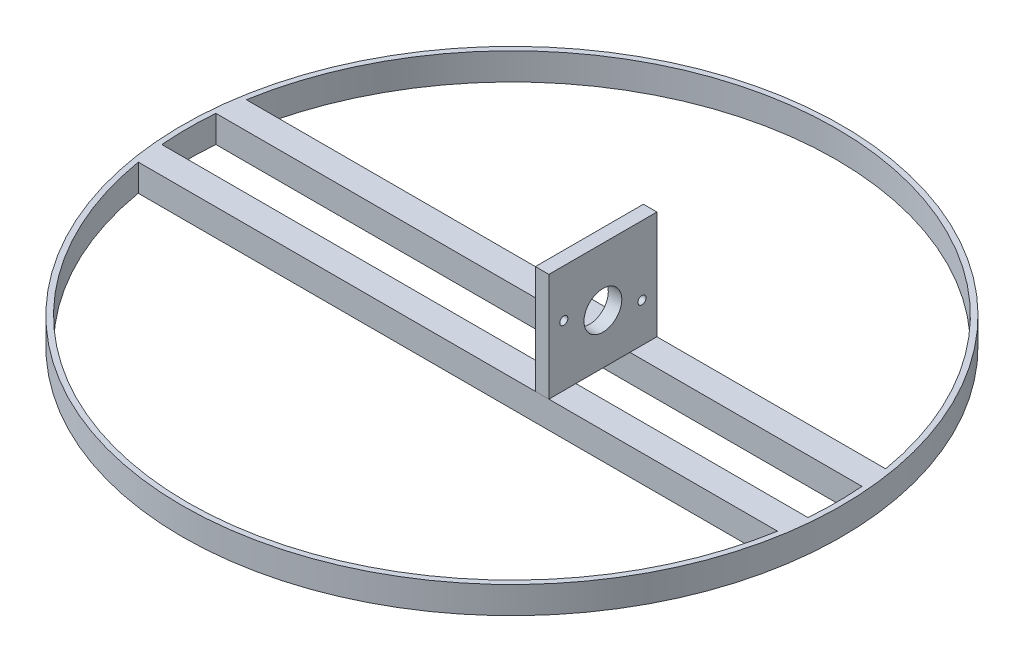
ISO-10303-21;
HEADER;
FILE_DESCRIPTION(('STEP AP214'),'2;1');
FILE_NAME('part.step','',(''),(''),'','','');
FILE_SCHEMA(('AUTOMOTIVE_DESIGN { 1 0 10303 214 1 1 1 1 }'));
ENDSEC;
DATA;
#1=APPLICATION_CONTEXT('core data for automotive mechanical design processes');
#2=APPLICATION_PROTOCOL_DEFINITION('international standard','automotive_design',2000,#1);
#3=PRODUCT_CONTEXT('',#1,'mechanical');
#4=PRODUCT('Part','Part','',(#3));
#5=PRODUCT_RELATED_PRODUCT_CATEGORY('part','',(#4));
#6=PRODUCT_DEFINITION_FORMATION('','',#4);
#7=PRODUCT_DEFINITION_CONTEXT('part definition',#1,'design');
#8=PRODUCT_DEFINITION('design','',#6,#7);
#9=PRODUCT_DEFINITION_SHAPE('','',#8);
#10=(LENGTH_UNIT() NAMED_UNIT(*) SI_UNIT(.MILLI.,.METRE.));
#11=(NAMED_UNIT(*) PLANE_ANGLE_UNIT() SI_UNIT($,.RADIAN.));
#12=(NAMED_UNIT(*) SI_UNIT($,.STERADIAN.) SOLID_ANGLE_UNIT());
#13=UNCERTAINTY_MEASURE_WITH_UNIT(LENGTH_MEASURE(1.E-05),#10,'distance_accuracy_value','');
#14=(GEOMETRIC_REPRESENTATION_CONTEXT(3) GLOBAL_UNCERTAINTY_ASSIGNED_CONTEXT((#13)) GLOBAL_UNIT_ASSIGNED_CONTEXT((#10,
#11,#12)) REPRESENTATION_CONTEXT('',''));
#15=CARTESIAN_POINT('',(0.,0.,0.));
#16=DIRECTION('',(0.,0.,1.));
#17=DIRECTION('',(1.,0.,0.));
#18=AXIS2_PLACEMENT_3D('',#15,#16,#17);
#19=CARTESIAN_POINT('',(-100.,0.,0.));
#20=DIRECTION('',(-1.,0.,0.));
#21=DIRECTION('',(0.,0.,1.));
#22=AXIS2_PLACEMENT_3D('',#19,#20,#21);
#23=PLANE('',#22);
#24=DIRECTION('',(0.,-1.,0.));
#25=VECTOR('',#24,1.);
#26=CARTESIAN_POINT('',(-100.,10.,120.860732568359));
#27=LINE('',#26,#25);
#28=CARTESIAN_POINT('',(-100.,50.,120.860732568359));
#29=VERTEX_POINT('',#28);
#30=CARTESIAN_POINT('',(-100.,10.,120.860732568359));
#31=VERTEX_POINT('',#30);
#32=EDGE_CURVE('E126',#29,#31,#27,.T.);
#33=ORIENTED_EDGE('',*,*,#32,.T.);
#34=DIRECTION('',(0.,0.,-1.));
#35=VECTOR('',#34,1.);
#36=CARTESIAN_POINT('',(-100.,10.,120.860732568359));
#37=LINE('',#36,#35);
#38=CARTESIAN_POINT('',(-100.,10.,80.8607325683594));
#39=VERTEX_POINT('',#38);
#40=EDGE_CURVE('E121',#31,#39,#37,.T.);
#41=ORIENTED_EDGE('',*,*,#40,.T.);
#42=DIRECTION('',(0.,1.,0.));
#43=VECTOR('',#42,1.);
#44=CARTESIAN_POINT('',(-100.,50.,80.8607325683594));
#45=LINE('',#44,#43);
#46=CARTESIAN_POINT('',(-100.,50.,80.8607325683594));
#47=VERTEX_POINT('',#46);
#48=EDGE_CURVE('E124',#39,#47,#45,.T.);
#49=ORIENTED_EDGE('',*,*,#48,.T.);
#50=DIRECTION('',(0.,0.,1.));
#51=VECTOR('',#50,1.);
#52=CARTESIAN_POINT('',(-100.,50.,120.860732568359));
#53=LINE('',#52,#51);
#54=EDGE_CURVE('E91',#47,#29,#53,.T.);
#55=ORIENTED_EDGE('',*,*,#54,.T.);
#56=EDGE_LOOP('',(#33,#41,#49,#55));
#57=FACE_BOUND('',#56,.T.);
#58=CARTESIAN_POINT('',(-100.,24.5198487765855,86.3891594698893));
#59=DIRECTION('',(1.,0.,0.));
#60=DIRECTION('',(0.,0.,-1.));
#61=AXIS2_PLACEMENT_3D('',#58,#59,#60);
#62=CIRCLE('',#61,1.50000000000001);
#63=CARTESIAN_POINT('',(-100.,24.5198487765855,84.8891594698893));
#64=VERTEX_POINT('',#63);
#65=EDGE_CURVE('E141',#64,#64,#62,.T.);
#66=ORIENTED_EDGE('',*,*,#65,.F.);
#67=EDGE_LOOP('',(#66));
#68=FACE_BOUND('',#67,.T.);
#69=CARTESIAN_POINT('',(-100.,32.4125218486534,115.33230566683));
#70=DIRECTION('',(1.,0.,0.));
#71=DIRECTION('',(0.,0.,-1.));
#72=AXIS2_PLACEMENT_3D('',#69,#70,#71);
#73=CIRCLE('',#72,1.50000000000001);
#74=CARTESIAN_POINT('',(-100.,32.4125218486534,113.83230566683));
#75=VERTEX_POINT('',#74);
#76=EDGE_CURVE('E156',#75,#75,#73,.T.);
#77=ORIENTED_EDGE('',*,*,#76,.F.);
#78=EDGE_LOOP('',(#77));
#79=FACE_BOUND('',#78,.T.);
#80=CARTESIAN_POINT('',(-100.,28.4661853126194,100.860732568359));
#81=DIRECTION('',(1.,0.,0.));
#82=DIRECTION('',(0.,0.,-1.));
#83=AXIS2_PLACEMENT_3D('',#80,#81,#82);
#84=CIRCLE('',#83,7.);
#85=CARTESIAN_POINT('',(-100.,28.4661853126194,93.8607325683594));
#86=VERTEX_POINT('',#85);
#87=EDGE_CURVE('E162',#86,#86,#84,.T.);
#88=ORIENTED_EDGE('',*,*,#87,.F.);
#89=EDGE_LOOP('',(#88));
#90=FACE_BOUND('',#89,.T.);
#91=ADVANCED_FACE('F74',(#57,#68,#79,#90),#23,.F.);
#92=CARTESIAN_POINT('',(-105.,0.,0.));
#93=DIRECTION('',(-1.,0.,0.));
#94=DIRECTION('',(0.,0.,1.));
#95=AXIS2_PLACEMENT_3D('',#92,#93,#94);
#96=PLANE('',#95);
#97=CARTESIAN_POINT('',(-105.,32.4125218486534,115.33230566683));
#98=DIRECTION('',(1.,0.,0.));
#99=DIRECTION('',(0.,0.,-1.));
#100=AXIS2_PLACEMENT_3D('',#97,#98,#99);
#101=CIRCLE('',#100,1.50000000000001);
#102=CARTESIAN_POINT('',(-105.,32.4125218486534,113.83230566683));
#103=VERTEX_POINT('',#102);
#104=EDGE_CURVE('E159',#103,#103,#101,.T.);
#105=ORIENTED_EDGE('',*,*,#104,.T.);
#106=EDGE_LOOP('',(#105));
#107=FACE_BOUND('',#106,.T.);
#108=DIRECTION('',(0.,-1.,0.));
#109=VECTOR('',#108,1.);
#110=CARTESIAN_POINT('',(-105.,10.,120.860732568359));
#111=LINE('',#110,#109);
#112=CARTESIAN_POINT('',(-105.,50.,120.860732568359));
#113=VERTEX_POINT('',#112);
#114=CARTESIAN_POINT('',(-105.,10.,120.860732568359));
#115=VERTEX_POINT('',#114);
#116=EDGE_CURVE('E138',#113,#115,#111,.T.);
#117=ORIENTED_EDGE('',*,*,#116,.F.);
#118=DIRECTION('',(0.,0.,1.));
#119=VECTOR('',#118,1.);
#120=CARTESIAN_POINT('',(-105.,50.,120.860732568359));
#121=LINE('',#120,#119);
#122=CARTESIAN_POINT('',(-105.,50.,80.8607325683594));
#123=VERTEX_POINT('',#122);
#124=EDGE_CURVE('E114',#123,#113,#121,.T.);
#125=ORIENTED_EDGE('',*,*,#124,.F.);
#126=DIRECTION('',(0.,1.,0.));
#127=VECTOR('',#126,1.);
#128=CARTESIAN_POINT('',(-105.,50.,80.8607325683594));
#129=LINE('',#128,#127);
#130=CARTESIAN_POINT('',(-105.,10.,80.8607325683594));
#131=VERTEX_POINT('',#130);
#132=EDGE_CURVE('E108',#131,#123,#129,.T.);
#133=ORIENTED_EDGE('',*,*,#132,.F.);
#134=DIRECTION('',(0.,0.,-1.));
#135=VECTOR('',#134,1.);
#136=CARTESIAN_POINT('',(-105.,10.,120.860732568359));
#137=LINE('',#136,#135);
#138=EDGE_CURVE('E130',#115,#131,#137,.T.);
#139=ORIENTED_EDGE('',*,*,#138,.F.);
#140=EDGE_LOOP('',(#117,#125,#133,#139));
#141=FACE_BOUND('',#140,.T.);
#142=CARTESIAN_POINT('',(-105.,24.5198487765855,86.3891594698893));
#143=DIRECTION('',(1.,0.,0.));
#144=DIRECTION('',(0.,0.,-1.));
#145=AXIS2_PLACEMENT_3D('',#142,#143,#144);
#146=CIRCLE('',#145,1.50000000000001);
#147=CARTESIAN_POINT('',(-105.,24.5198487765855,84.8891594698893));
#148=VERTEX_POINT('',#147);
#149=EDGE_CURVE('E153',#148,#148,#146,.T.);
#150=ORIENTED_EDGE('',*,*,#149,.T.);
#151=EDGE_LOOP('',(#150));
#152=FACE_BOUND('',#151,.T.);
#153=CARTESIAN_POINT('',(-105.,28.4661853126194,100.860732568359));
#154=DIRECTION('',(1.,0.,0.));
#155=DIRECTION('',(0.,0.,-1.));
#156=AXIS2_PLACEMENT_3D('',#153,#154,#155);
#157=CIRCLE('',#156,7.);
#158=CARTESIAN_POINT('',(-105.,28.4661853126194,93.8607325683594));
#159=VERTEX_POINT('',#158);
#160=EDGE_CURVE('E165',#159,#159,#157,.T.);
#161=ORIENTED_EDGE('',*,*,#160,.T.);
#162=EDGE_LOOP('',(#161));
#163=FACE_BOUND('',#162,.T.);
#164=ADVANCED_FACE('F149',(#107,#141,#152,#163),#96,.T.);
#165=CARTESIAN_POINT('',(-100.,10.,120.860732568359));
#166=DIRECTION('',(0.,0.,-1.));
#167=DIRECTION('',(-1.,0.,0.));
#168=AXIS2_PLACEMENT_3D('',#165,#166,#167);
#169=PLANE('',#168);
#170=ORIENTED_EDGE('',*,*,#116,.T.);
#171=DIRECTION('',(-1.,0.,0.));
#172=VECTOR('',#171,1.);
#173=CARTESIAN_POINT('',(-100.,10.,120.860732568359));
#174=LINE('',#173,#172);
#175=EDGE_CURVE('E14',#31,#115,#174,.T.);
#176=ORIENTED_EDGE('',*,*,#175,.F.);
#177=ORIENTED_EDGE('',*,*,#32,.F.);
#178=DIRECTION('',(-1.,0.,0.));
#179=VECTOR('',#178,1.);
#180=CARTESIAN_POINT('',(-100.,50.,120.860732568359));
#181=LINE('',#180,#179);
#182=EDGE_CURVE('E134',#29,#113,#181,.T.);
#183=ORIENTED_EDGE('',*,*,#182,.T.);
#184=EDGE_LOOP('',(#170,#176,#177,#183));
#185=FACE_BOUND('',#184,.T.);
#186=ADVANCED_FACE('F76',(#185),#169,.F.);
#187=CARTESIAN_POINT('',(-100.,10.,120.860732568359));
#188=DIRECTION('',(0.,1.,0.));
#189=DIRECTION('',(0.,0.,1.));
#190=AXIS2_PLACEMENT_3D('',#187,#188,#189);
#191=PLANE('',#190);
#192=ORIENTED_EDGE('',*,*,#138,.T.);
#193=DIRECTION('',(-1.,0.,0.));
#194=VECTOR('',#193,1.);
#195=CARTESIAN_POINT('',(-100.,10.,80.8607325683594));
#196=LINE('',#195,#194);
#197=EDGE_CURVE('E83',#39,#131,#196,.T.);
#198=ORIENTED_EDGE('',*,*,#197,.F.);
#199=ORIENTED_EDGE('',*,*,#40,.F.);
#200=ORIENTED_EDGE('',*,*,#175,.T.);
#201=EDGE_LOOP('',(#192,#198,#199,#200));
#202=FACE_BOUND('',#201,.T.);
#203=ADVANCED_FACE('F129',(#202),#191,.F.);
#204=CARTESIAN_POINT('',(-100.,50.,80.8607325683594));
#205=DIRECTION('',(0.,0.,1.));
#206=DIRECTION('',(1.,0.,0.));
#207=AXIS2_PLACEMENT_3D('',#204,#205,#206);
#208=PLANE('',#207);
#209=ORIENTED_EDGE('',*,*,#132,.T.);
#210=DIRECTION('',(-1.,0.,0.));
#211=VECTOR('',#210,1.);
#212=CARTESIAN_POINT('',(-100.,50.,80.8607325683594));
#213=LINE('',#212,#211);
#214=EDGE_CURVE('E131',#47,#123,#213,.T.);
#215=ORIENTED_EDGE('',*,*,#214,.F.);
#216=ORIENTED_EDGE('',*,*,#48,.F.);
#217=ORIENTED_EDGE('',*,*,#197,.T.);
#218=EDGE_LOOP('',(#209,#215,#216,#217));
#219=FACE_BOUND('',#218,.T.);
#220=ADVANCED_FACE('F132',(#219),#208,.F.);
#221=CARTESIAN_POINT('',(-100.,50.,120.860732568359));
#222=DIRECTION('',(0.,-1.,0.));
#223=DIRECTION('',(0.,0.,-1.));
#224=AXIS2_PLACEMENT_3D('',#221,#222,#223);
#225=PLANE('',#224);
#226=ORIENTED_EDGE('',*,*,#124,.T.);
#227=ORIENTED_EDGE('',*,*,#182,.F.);
#228=ORIENTED_EDGE('',*,*,#54,.F.);
#229=ORIENTED_EDGE('',*,*,#214,.T.);
#230=EDGE_LOOP('',(#226,#227,#228,#229));
#231=FACE_BOUND('',#230,.T.);
#232=ADVANCED_FACE('F146',(#231),#225,.F.);
#233=CARTESIAN_POINT('',(-100.,24.5198487765855,86.3891594698893));
#234=DIRECTION('',(-1.,0.,0.));
#235=DIRECTION('',(0.,0.,1.));
#236=AXIS2_PLACEMENT_3D('',#233,#234,#235);
#237=CYLINDRICAL_SURFACE('',#236,1.50000000000001);
#238=ORIENTED_EDGE('',*,*,#65,.T.);
#239=EDGE_LOOP('',(#238));
#240=FACE_BOUND('',#239,.T.);
#241=ORIENTED_EDGE('',*,*,#149,.F.);
#242=EDGE_LOOP('',(#241));
#243=FACE_BOUND('',#242,.T.);
#244=ADVANCED_FACE('F182',(#240,#243),#237,.F.);
#245=CARTESIAN_POINT('',(-100.,32.4125218486534,115.33230566683));
#246=DIRECTION('',(-1.,0.,0.));
#247=DIRECTION('',(0.,0.,1.));
#248=AXIS2_PLACEMENT_3D('',#245,#246,#247);
#249=CYLINDRICAL_SURFACE('',#248,1.50000000000001);
#250=ORIENTED_EDGE('',*,*,#76,.T.);
#251=EDGE_LOOP('',(#250));
#252=FACE_BOUND('',#251,.T.);
#253=ORIENTED_EDGE('',*,*,#104,.F.);
#254=EDGE_LOOP('',(#253));
#255=FACE_BOUND('',#254,.T.);
#256=ADVANCED_FACE('F228',(#252,#255),#249,.F.);
#257=CARTESIAN_POINT('',(-100.,28.4661853126194,100.860732568359));
#258=DIRECTION('',(-1.,0.,0.));
#259=DIRECTION('',(0.,0.,1.));
#260=AXIS2_PLACEMENT_3D('',#257,#258,#259);
#261=CYLINDRICAL_SURFACE('',#260,7.);
#262=ORIENTED_EDGE('',*,*,#87,.T.);
#263=EDGE_LOOP('',(#262));
#264=FACE_BOUND('',#263,.T.);
#265=ORIENTED_EDGE('',*,*,#160,.F.);
#266=EDGE_LOOP('',(#265));
#267=FACE_BOUND('',#266,.T.);
#268=ADVANCED_FACE('F171',(#264,#267),#261,.F.);
#269=CLOSED_SHELL('',(#91,#164,#186,#203,#220,#232,#244,#256,#268));
#270=MANIFOLD_SOLID_BREP('B2',#269);
#271=CARTESIAN_POINT('',(-133.671737877986,10.,100.860732568359));
#272=DIRECTION('',(0.,1.,0.));
#273=DIRECTION('',(0.,0.,1.));
#274=AXIS2_PLACEMENT_3D('',#271,#272,#273);
#275=PLANE('',#274);
#276=CARTESIAN_POINT('',(-133.671737877986,10.,100.860732568359));
#277=DIRECTION('',(0.,1.,0.));
#278=DIRECTION('',(0.,0.,1.));
#279=AXIS2_PLACEMENT_3D('',#276,#277,#278);
#280=CIRCLE('',#279,120.);
#281=CARTESIAN_POINT('',(-15.3501422159941,10.,80.8607325683594));
#282=VERTEX_POINT('',#281);
#283=CARTESIAN_POINT('',(-251.993333539979,10.,80.8607325683594));
#284=VERTEX_POINT('',#283);
#285=EDGE_CURVE('E333',#282,#284,#280,.T.);
#286=ORIENTED_EDGE('',*,*,#285,.F.);
#287=DIRECTION('',(1.,0.,0.));
#288=VECTOR('',#287,1.);
#289=CARTESIAN_POINT('',(-300.,10.,80.8607325683594));
#290=LINE('',#289,#288);
#291=EDGE_CURVE('E364',#284,#282,#290,.T.);
#292=ORIENTED_EDGE('',*,*,#291,.F.);
#293=EDGE_LOOP('',(#286,#292));
#294=FACE_BOUND('',#293,.T.);
#295=CARTESIAN_POINT('',(-253.254345309,10.,90.8607325683594));
#296=VERTEX_POINT('',#295);
#297=CARTESIAN_POINT('',(-253.254345309,10.,110.860732568359));
#298=VERTEX_POINT('',#297);
#299=EDGE_CURVE('E349',#296,#298,#280,.T.);
#300=ORIENTED_EDGE('',*,*,#299,.F.);
#301=DIRECTION('',(1.,0.,0.));
#302=VECTOR('',#301,1.);
#303=CARTESIAN_POINT('',(-300.,10.,90.8607325683594));
#304=LINE('',#303,#302);
#305=CARTESIAN_POINT('',(-14.0891304469725,10.,90.8607325683594));
#306=VERTEX_POINT('',#305);
#307=EDGE_CURVE('E341',#296,#306,#304,.T.);
#308=ORIENTED_EDGE('',*,*,#307,.T.);
#309=CARTESIAN_POINT('',(-14.0891304469725,10.,110.860732568359));
#310=VERTEX_POINT('',#309);
#311=EDGE_CURVE('E321',#310,#306,#280,.T.);
#312=ORIENTED_EDGE('',*,*,#311,.F.);
#313=DIRECTION('',(1.,0.,0.));
#314=VECTOR('',#313,1.);
#315=CARTESIAN_POINT('',(-300.,10.,110.860732568359));
#316=LINE('',#315,#314);
#317=EDGE_CURVE('E359',#298,#310,#316,.T.);
#318=ORIENTED_EDGE('',*,*,#317,.F.);
#319=EDGE_LOOP('',(#300,#308,#312,#318));
#320=FACE_BOUND('',#319,.T.);
#321=CARTESIAN_POINT('',(-251.993333539979,10.,120.860732568359));
#322=VERTEX_POINT('',#321);
#323=CARTESIAN_POINT('',(-15.3501422159941,10.,120.860732568359));
#324=VERTEX_POINT('',#323);
#325=EDGE_CURVE('E335',#322,#324,#280,.T.);
#326=ORIENTED_EDGE('',*,*,#325,.F.);
#327=DIRECTION('',(1.,0.,0.));
#328=VECTOR('',#327,1.);
#329=CARTESIAN_POINT('',(-300.,10.,120.860732568359));
#330=LINE('',#329,#328);
#331=EDGE_CURVE('E355',#322,#324,#330,.T.);
#332=ORIENTED_EDGE('',*,*,#331,.T.);
#333=EDGE_LOOP('',(#326,#332));
#334=FACE_BOUND('',#333,.T.);
#335=CARTESIAN_POINT('',(-133.671737877986,10.,100.860732568359));
#336=DIRECTION('',(0.,1.,0.));
#337=DIRECTION('',(0.,0.,1.));
#338=AXIS2_PLACEMENT_3D('',#335,#336,#337);
#339=CIRCLE('',#338,122.);
#340=CARTESIAN_POINT('',(-133.671737877986,10.,222.860732568359));
#341=VERTEX_POINT('',#340);
#342=EDGE_CURVE('E371',#341,#341,#339,.T.);
#343=ORIENTED_EDGE('',*,*,#342,.T.);
#344=EDGE_LOOP('',(#343));
#345=FACE_BOUND('',#344,.T.);
#346=ADVANCED_FACE('F260',(#294,#320,#334,#345),#275,.T.);
#347=CARTESIAN_POINT('',(-133.671737877986,0.,100.860732568359));
#348=DIRECTION('',(0.,1.,0.));
#349=DIRECTION('',(0.,0.,1.));
#350=AXIS2_PLACEMENT_3D('',#347,#348,#349);
#351=PLANE('',#350);
#352=DIRECTION('',(1.,0.,0.));
#353=VECTOR('',#352,1.);
#354=CARTESIAN_POINT('',(-300.,0.,80.8607325683594));
#355=LINE('',#354,#353);
#356=CARTESIAN_POINT('',(-251.993333539979,0.,80.8607325683594));
#357=VERTEX_POINT('',#356);
#358=CARTESIAN_POINT('',(-15.3501422159941,0.,80.8607325683594));
#359=VERTEX_POINT('',#358);
#360=EDGE_CURVE('E351',#357,#359,#355,.T.);
#361=ORIENTED_EDGE('',*,*,#360,.T.);
#362=CARTESIAN_POINT('',(-133.671737877986,0.,100.860732568359));
#363=DIRECTION('',(0.,1.,0.));
#364=DIRECTION('',(0.,0.,1.));
#365=AXIS2_PLACEMENT_3D('',#362,#363,#364);
#366=CIRCLE('',#365,120.);
#367=EDGE_CURVE('E278',#359,#357,#366,.T.);
#368=ORIENTED_EDGE('',*,*,#367,.T.);
#369=EDGE_LOOP('',(#361,#368));
#370=FACE_BOUND('',#369,.T.);
#371=DIRECTION('',(1.,0.,0.));
#372=VECTOR('',#371,1.);
#373=CARTESIAN_POINT('',(-300.,0.,90.8607325683594));
#374=LINE('',#373,#372);
#375=CARTESIAN_POINT('',(-253.254345309,0.,90.8607325683594));
#376=VERTEX_POINT('',#375);
#377=CARTESIAN_POINT('',(-14.0891304469725,0.,90.8607325683594));
#378=VERTEX_POINT('',#377);
#379=EDGE_CURVE('E343',#376,#378,#374,.T.);
#380=ORIENTED_EDGE('',*,*,#379,.F.);
#381=CARTESIAN_POINT('',(-253.254345309,0.,110.860732568359));
#382=VERTEX_POINT('',#381);
#383=EDGE_CURVE('E370',#376,#382,#366,.T.);
#384=ORIENTED_EDGE('',*,*,#383,.T.);
#385=DIRECTION('',(1.,0.,0.));
#386=VECTOR('',#385,1.);
#387=CARTESIAN_POINT('',(-300.,0.,110.860732568359));
#388=LINE('',#387,#386);
#389=CARTESIAN_POINT('',(-14.0891304469725,0.,110.860732568359));
#390=VERTEX_POINT('',#389);
#391=EDGE_CURVE('E361',#382,#390,#388,.T.);
#392=ORIENTED_EDGE('',*,*,#391,.T.);
#393=EDGE_CURVE('E367',#390,#378,#366,.T.);
#394=ORIENTED_EDGE('',*,*,#393,.T.);
#395=EDGE_LOOP('',(#380,#384,#392,#394));
#396=FACE_BOUND('',#395,.T.);
#397=DIRECTION('',(1.,0.,0.));
#398=VECTOR('',#397,1.);
#399=CARTESIAN_POINT('',(-300.,0.,120.860732568359));
#400=LINE('',#399,#398);
#401=CARTESIAN_POINT('',(-251.993333539979,0.,120.860732568359));
#402=VERTEX_POINT('',#401);
#403=CARTESIAN_POINT('',(-15.3501422159941,0.,120.860732568359));
#404=VERTEX_POINT('',#403);
#405=EDGE_CURVE('E363',#402,#404,#400,.T.);
#406=ORIENTED_EDGE('',*,*,#405,.F.);
#407=EDGE_CURVE('E358',#402,#404,#366,.T.);
#408=ORIENTED_EDGE('',*,*,#407,.T.);
#409=EDGE_LOOP('',(#406,#408));
#410=FACE_BOUND('',#409,.T.);
#411=CARTESIAN_POINT('',(-133.671737877986,0.,100.860732568359));
#412=DIRECTION('',(0.,1.,0.));
#413=DIRECTION('',(0.,0.,1.));
#414=AXIS2_PLACEMENT_3D('',#411,#412,#413);
#415=CIRCLE('',#414,122.);
#416=CARTESIAN_POINT('',(-133.671737877986,0.,222.860732568359));
#417=VERTEX_POINT('',#416);
#418=EDGE_CURVE('E332',#417,#417,#415,.T.);
#419=ORIENTED_EDGE('',*,*,#418,.F.);
#420=EDGE_LOOP('',(#419));
#421=FACE_BOUND('',#420,.T.);
#422=ADVANCED_FACE('F394',(#370,#396,#410,#421),#351,.F.);
#423=CARTESIAN_POINT('',(-133.671737877986,10.,100.860732568359));
#424=DIRECTION('',(0.,-1.,0.));
#425=DIRECTION('',(0.,0.,-1.));
#426=AXIS2_PLACEMENT_3D('',#423,#424,#425);
#427=CYLINDRICAL_SURFACE('',#426,120.);
#428=DIRECTION('',(0.,-1.,0.));
#429=VECTOR('',#428,1.);
#430=CARTESIAN_POINT('',(-15.3501422159941,10.,80.8607325683594));
#431=LINE('',#430,#429);
#432=EDGE_CURVE('E72',#282,#359,#431,.T.);
#433=ORIENTED_EDGE('',*,*,#432,.F.);
#434=ORIENTED_EDGE('',*,*,#285,.T.);
#435=DIRECTION('',(0.,-1.,0.));
#436=VECTOR('',#435,1.);
#437=CARTESIAN_POINT('',(-251.993333539979,10.,80.8607325683594));
#438=LINE('',#437,#436);
#439=EDGE_CURVE('E268',#357,#284,#438,.F.);
#440=ORIENTED_EDGE('',*,*,#439,.F.);
#441=ORIENTED_EDGE('',*,*,#367,.F.);
#442=EDGE_LOOP('',(#433,#434,#440,#441));
#443=FACE_BOUND('',#442,.T.);
#444=ADVANCED_FACE('F403',(#443),#427,.F.);
#445=DIRECTION('',(0.,-1.,0.));
#446=VECTOR('',#445,1.);
#447=CARTESIAN_POINT('',(-253.254345309,10.,90.8607325683594));
#448=LINE('',#447,#446);
#449=EDGE_CURVE('E344',#296,#376,#448,.T.);
#450=ORIENTED_EDGE('',*,*,#449,.F.);
#451=ORIENTED_EDGE('',*,*,#299,.T.);
#452=DIRECTION('',(0.,-1.,0.));
#453=VECTOR('',#452,1.);
#454=CARTESIAN_POINT('',(-253.254345309,10.,110.860732568359));
#455=LINE('',#454,#453);
#456=EDGE_CURVE('E374',#382,#298,#455,.F.);
#457=ORIENTED_EDGE('',*,*,#456,.F.);
#458=ORIENTED_EDGE('',*,*,#383,.F.);
#459=EDGE_LOOP('',(#450,#451,#457,#458));
#460=FACE_BOUND('',#459,.T.);
#461=ADVANCED_FACE('F402',(#460),#427,.F.);
#462=DIRECTION('',(0.,-1.,0.));
#463=VECTOR('',#462,1.);
#464=CARTESIAN_POINT('',(-251.993333539979,10.,120.860732568359));
#465=LINE('',#464,#463);
#466=EDGE_CURVE('E345',#322,#402,#465,.T.);
#467=ORIENTED_EDGE('',*,*,#466,.F.);
#468=ORIENTED_EDGE('',*,*,#325,.T.);
#469=DIRECTION('',(0.,-1.,0.));
#470=VECTOR('',#469,1.);
#471=CARTESIAN_POINT('',(-15.3501422159941,10.,120.860732568359));
#472=LINE('',#471,#470);
#473=EDGE_CURVE('E380',#404,#324,#472,.F.);
#474=ORIENTED_EDGE('',*,*,#473,.F.);
#475=ORIENTED_EDGE('',*,*,#407,.F.);
#476=EDGE_LOOP('',(#467,#468,#474,#475));
#477=FACE_BOUND('',#476,.T.);
#478=ADVANCED_FACE('F410',(#477),#427,.F.);
#479=CARTESIAN_POINT('',(-133.671737877986,10.,100.860732568359));
#480=DIRECTION('',(0.,-1.,0.));
#481=DIRECTION('',(0.,0.,-1.));
#482=AXIS2_PLACEMENT_3D('',#479,#480,#481);
#483=CYLINDRICAL_SURFACE('',#482,122.);
#484=ORIENTED_EDGE('',*,*,#342,.F.);
#485=EDGE_LOOP('',(#484));
#486=FACE_BOUND('',#485,.T.);
#487=ORIENTED_EDGE('',*,*,#418,.T.);
#488=EDGE_LOOP('',(#487));
#489=FACE_BOUND('',#488,.T.);
#490=ADVANCED_FACE('F262',(#486,#489),#483,.T.);
#491=DIRECTION('',(0.,-1.,0.));
#492=VECTOR('',#491,1.);
#493=CARTESIAN_POINT('',(-14.0891304469725,10.,90.8607325683594));
#494=LINE('',#493,#492);
#495=EDGE_CURVE('E325',#378,#306,#494,.F.);
#496=ORIENTED_EDGE('',*,*,#495,.F.);
#497=ORIENTED_EDGE('',*,*,#393,.F.);
#498=DIRECTION('',(0.,-1.,0.));
#499=VECTOR('',#498,1.);
#500=CARTESIAN_POINT('',(-14.0891304469725,10.,110.860732568359));
#501=LINE('',#500,#499);
#502=EDGE_CURVE('E328',#310,#390,#501,.T.);
#503=ORIENTED_EDGE('',*,*,#502,.F.);
#504=ORIENTED_EDGE('',*,*,#311,.T.);
#505=EDGE_LOOP('',(#496,#497,#503,#504));
#506=FACE_BOUND('',#505,.T.);
#507=ADVANCED_FACE('F323',(#506),#427,.F.);
#508=CARTESIAN_POINT('',(-300.,10.,110.860732568359));
#509=DIRECTION('',(0.,0.,-1.));
#510=DIRECTION('',(-1.,0.,0.));
#511=AXIS2_PLACEMENT_3D('',#508,#509,#510);
#512=PLANE('',#511);
#513=ORIENTED_EDGE('',*,*,#317,.T.);
#514=ORIENTED_EDGE('',*,*,#502,.T.);
#515=ORIENTED_EDGE('',*,*,#391,.F.);
#516=ORIENTED_EDGE('',*,*,#456,.T.);
#517=EDGE_LOOP('',(#513,#514,#515,#516));
#518=FACE_BOUND('',#517,.T.);
#519=ADVANCED_FACE('F401',(#518),#512,.T.);
#520=CARTESIAN_POINT('',(-300.,10.,120.860732568359));
#521=DIRECTION('',(0.,0.,1.));
#522=DIRECTION('',(1.,0.,0.));
#523=AXIS2_PLACEMENT_3D('',#520,#521,#522);
#524=PLANE('',#523);
#525=ORIENTED_EDGE('',*,*,#331,.F.);
#526=ORIENTED_EDGE('',*,*,#466,.T.);
#527=ORIENTED_EDGE('',*,*,#405,.T.);
#528=ORIENTED_EDGE('',*,*,#473,.T.);
#529=EDGE_LOOP('',(#525,#526,#527,#528));
#530=FACE_BOUND('',#529,.T.);
#531=ADVANCED_FACE('F448',(#530),#524,.T.);
#532=CARTESIAN_POINT('',(-300.,10.,90.8607325683594));
#533=DIRECTION('',(0.,0.,1.));
#534=DIRECTION('',(1.,0.,0.));
#535=AXIS2_PLACEMENT_3D('',#532,#533,#534);
#536=PLANE('',#535);
#537=ORIENTED_EDGE('',*,*,#307,.F.);
#538=ORIENTED_EDGE('',*,*,#449,.T.);
#539=ORIENTED_EDGE('',*,*,#379,.T.);
#540=ORIENTED_EDGE('',*,*,#495,.T.);
#541=EDGE_LOOP('',(#537,#538,#539,#540));
#542=FACE_BOUND('',#541,.T.);
#543=ADVANCED_FACE('F339',(#542),#536,.T.);
#544=CARTESIAN_POINT('',(-300.,10.,80.8607325683594));
#545=DIRECTION('',(0.,0.,-1.));
#546=DIRECTION('',(-1.,0.,0.));
#547=AXIS2_PLACEMENT_3D('',#544,#545,#546);
#548=PLANE('',#547);
#549=ORIENTED_EDGE('',*,*,#291,.T.);
#550=ORIENTED_EDGE('',*,*,#432,.T.);
#551=ORIENTED_EDGE('',*,*,#360,.F.);
#552=ORIENTED_EDGE('',*,*,#439,.T.);
#553=EDGE_LOOP('',(#549,#550,#551,#552));
#554=FACE_BOUND('',#553,.T.);
#555=ADVANCED_FACE('F388',(#554),#548,.T.);
#556=CLOSED_SHELL('',(#346,#422,#444,#461,#478,#490,#507,#519,#531,#543,#555));
#557=MANIFOLD_SOLID_BREP('B8',#556);
#558=ADVANCED_BREP_SHAPE_REPRESENTATION('',(#18,#270,#557),#14);
#559=SHAPE_DEFINITION_REPRESENTATION(#9,#558);
ENDSEC;
END-ISO-10303-21;
